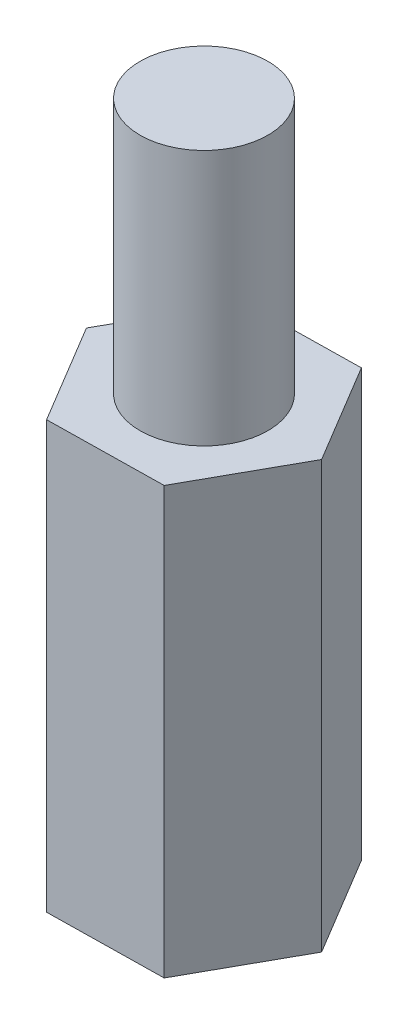
ISO-10303-21;
HEADER;
FILE_DESCRIPTION(('STEP AP214'),'2;1');
FILE_NAME('part.step','',(''),(''),'','','');
FILE_SCHEMA(('AUTOMOTIVE_DESIGN { 1 0 10303 214 1 1 1 1 }'));
ENDSEC;
DATA;
#1=APPLICATION_CONTEXT('core data for automotive mechanical design processes');
#2=APPLICATION_PROTOCOL_DEFINITION('international standard','automotive_design',2000,#1);
#3=PRODUCT_CONTEXT('',#1,'mechanical');
#4=PRODUCT('Part','Part','',(#3));
#5=PRODUCT_RELATED_PRODUCT_CATEGORY('part','',(#4));
#6=PRODUCT_DEFINITION_FORMATION('','',#4);
#7=PRODUCT_DEFINITION_CONTEXT('part definition',#1,'design');
#8=PRODUCT_DEFINITION('design','',#6,#7);
#9=PRODUCT_DEFINITION_SHAPE('','',#8);
#10=(LENGTH_UNIT() NAMED_UNIT(*) SI_UNIT(.MILLI.,.METRE.));
#11=(NAMED_UNIT(*) PLANE_ANGLE_UNIT() SI_UNIT($,.RADIAN.));
#12=(NAMED_UNIT(*) SI_UNIT($,.STERADIAN.) SOLID_ANGLE_UNIT());
#13=UNCERTAINTY_MEASURE_WITH_UNIT(LENGTH_MEASURE(1.E-05),#10,'distance_accuracy_value','');
#14=(GEOMETRIC_REPRESENTATION_CONTEXT(3) GLOBAL_UNCERTAINTY_ASSIGNED_CONTEXT((#13)) GLOBAL_UNIT_ASSIGNED_CONTEXT((#10,
#11,#12)) REPRESENTATION_CONTEXT('',''));
#15=CARTESIAN_POINT('',(0.,0.,0.));
#16=DIRECTION('',(0.,0.,1.));
#17=DIRECTION('',(1.,0.,0.));
#18=AXIS2_PLACEMENT_3D('',#15,#16,#17);
#19=CARTESIAN_POINT('',(0.,16.,0.));
#20=DIRECTION('',(0.,-1.,0.));
#21=DIRECTION('',(0.,0.,-1.));
#22=AXIS2_PLACEMENT_3D('',#19,#20,#21);
#23=CYLINDRICAL_SURFACE('',#22,1.5);
#24=CARTESIAN_POINT('',(0.,16.,0.));
#25=DIRECTION('',(0.,1.,0.));
#26=DIRECTION('',(0.,0.,1.));
#27=AXIS2_PLACEMENT_3D('',#24,#25,#26);
#28=CIRCLE('',#27,1.5);
#29=CARTESIAN_POINT('',(0.,16.,1.5));
#30=VERTEX_POINT('',#29);
#31=EDGE_CURVE('E11',#30,#30,#28,.T.);
#32=ORIENTED_EDGE('',*,*,#31,.F.);
#33=EDGE_LOOP('',(#32));
#34=FACE_BOUND('',#33,.T.);
#35=CARTESIAN_POINT('',(0.,10.,0.));
#36=DIRECTION('',(0.,1.,0.));
#37=DIRECTION('',(0.,0.,1.));
#38=AXIS2_PLACEMENT_3D('',#35,#36,#37);
#39=CIRCLE('',#38,1.5);
#40=CARTESIAN_POINT('',(0.,10.,1.5));
#41=VERTEX_POINT('',#40);
#42=EDGE_CURVE('E45',#41,#41,#39,.T.);
#43=ORIENTED_EDGE('',*,*,#42,.T.);
#44=EDGE_LOOP('',(#43));
#45=FACE_BOUND('',#44,.T.);
#46=ADVANCED_FACE('F42',(#34,#45),#23,.T.);
#47=CARTESIAN_POINT('',(0.,16.,0.));
#48=DIRECTION('',(0.,1.,0.));
#49=DIRECTION('',(0.,0.,1.));
#50=AXIS2_PLACEMENT_3D('',#47,#48,#49);
#51=PLANE('',#50);
#52=ORIENTED_EDGE('',*,*,#31,.T.);
#53=EDGE_LOOP('',(#52));
#54=FACE_BOUND('',#53,.T.);
#55=ADVANCED_FACE('F57',(#54),#51,.T.);
#56=CARTESIAN_POINT('',(0.,10.,0.));
#57=DIRECTION('',(0.,1.,0.));
#58=DIRECTION('',(0.,0.,1.));
#59=AXIS2_PLACEMENT_3D('',#56,#57,#58);
#60=PLANE('',#59);
#61=ORIENTED_EDGE('',*,*,#42,.F.);
#62=EDGE_LOOP('',(#61));
#63=FACE_BOUND('',#62,.T.);
#64=ADVANCED_FACE('F55',(#63),#60,.F.);
#65=CLOSED_SHELL('',(#46,#55,#64));
#66=MANIFOLD_SOLID_BREP('B2',#65);
#67=CARTESIAN_POINT('',(0.,10.,0.));
#68=DIRECTION('',(0.,1.,0.));
#69=DIRECTION('',(0.,0.,1.));
#70=AXIS2_PLACEMENT_3D('',#67,#68,#69);
#71=PLANE('',#70);
#72=DIRECTION('',(0.9998697085006,0.,-0.0161420575803037));
#73=VECTOR('',#72,1.);
#74=CARTESIAN_POINT('',(-1.31866252127611,10.,2.37159492500618));
#75=LINE('',#74,#73);
#76=CARTESIAN_POINT('',(-1.31866252127611,10.,2.37159492500618));
#77=VERTEX_POINT('',#76);
#78=CARTESIAN_POINT('',(1.39453019190354,10.,2.32779270494664));
#79=VERTEX_POINT('',#78);
#80=EDGE_CURVE('E178',#77,#79,#75,.T.);
#81=ORIENTED_EDGE('',*,*,#80,.T.);
#82=DIRECTION('',(0.485955422316405,0.,-0.873983596826213));
#83=VECTOR('',#82,1.);
#84=CARTESIAN_POINT('',(1.39453019190354,10.,2.32779270494664));
#85=LINE('',#84,#83);
#86=CARTESIAN_POINT('',(2.71319271317966,10.,-0.0438022200595355));
#87=VERTEX_POINT('',#86);
#88=EDGE_CURVE('E136',#79,#87,#85,.T.);
#89=ORIENTED_EDGE('',*,*,#88,.T.);
#90=DIRECTION('',(-0.513914286184194,0.,-0.857841539245909));
#91=VECTOR('',#90,1.);
#92=CARTESIAN_POINT('',(2.71319271317966,10.,-0.0438022200595355));
#93=LINE('',#92,#91);
#94=CARTESIAN_POINT('',(1.31866252127611,10.,-2.37159492500618));
#95=VERTEX_POINT('',#94);
#96=EDGE_CURVE('E149',#87,#95,#93,.T.);
#97=ORIENTED_EDGE('',*,*,#96,.T.);
#98=DIRECTION('',(-0.9998697085006,0.,0.0161420575803037));
#99=VECTOR('',#98,1.);
#100=CARTESIAN_POINT('',(1.31866252127611,10.,-2.37159492500618));
#101=LINE('',#100,#99);
#102=CARTESIAN_POINT('',(-1.39453019190354,10.,-2.32779270494664));
#103=VERTEX_POINT('',#102);
#104=EDGE_CURVE('E143',#95,#103,#101,.T.);
#105=ORIENTED_EDGE('',*,*,#104,.T.);
#106=DIRECTION('',(-0.485955422316406,0.,0.873983596826213));
#107=VECTOR('',#106,1.);
#108=CARTESIAN_POINT('',(-1.39453019190354,10.,-2.32779270494664));
#109=LINE('',#108,#107);
#110=CARTESIAN_POINT('',(-2.71319271317966,10.,0.043802220059535));
#111=VERTEX_POINT('',#110);
#112=EDGE_CURVE('E147',#103,#111,#109,.T.);
#113=ORIENTED_EDGE('',*,*,#112,.T.);
#114=DIRECTION('',(0.513914286184194,0.,0.857841539245909));
#115=VECTOR('',#114,1.);
#116=CARTESIAN_POINT('',(-2.71319271317966,10.,0.043802220059535));
#117=LINE('',#116,#115);
#118=EDGE_CURVE('E99',#111,#77,#117,.T.);
#119=ORIENTED_EDGE('',*,*,#118,.T.);
#120=EDGE_LOOP('',(#81,#89,#97,#105,#113,#119));
#121=FACE_BOUND('',#120,.T.);
#122=CARTESIAN_POINT('',(0.,10.,0.));
#123=DIRECTION('',(0.,1.,0.));
#124=DIRECTION('',(0.,0.,1.));
#125=AXIS2_PLACEMENT_3D('',#122,#123,#124);
#126=CIRCLE('',#125,1.5);
#127=CARTESIAN_POINT('',(0.,10.,1.5));
#128=VERTEX_POINT('',#127);
#129=EDGE_CURVE('E171',#128,#128,#126,.T.);
#130=ORIENTED_EDGE('',*,*,#129,.F.);
#131=EDGE_LOOP('',(#130));
#132=FACE_BOUND('',#131,.T.);
#133=ADVANCED_FACE('F82',(#121,#132),#71,.T.);
#134=CARTESIAN_POINT('',(0.,0.,0.));
#135=DIRECTION('',(0.,1.,0.));
#136=DIRECTION('',(0.,0.,1.));
#137=AXIS2_PLACEMENT_3D('',#134,#135,#136);
#138=PLANE('',#137);
#139=DIRECTION('',(0.9998697085006,0.,-0.0161420575803037));
#140=VECTOR('',#139,1.);
#141=CARTESIAN_POINT('',(-1.31866252127611,0.,2.37159492500618));
#142=LINE('',#141,#140);
#143=CARTESIAN_POINT('',(-1.31866252127611,0.,2.37159492500618));
#144=VERTEX_POINT('',#143);
#145=CARTESIAN_POINT('',(1.39453019190354,0.,2.32779270494664));
#146=VERTEX_POINT('',#145);
#147=EDGE_CURVE('E167',#144,#146,#142,.T.);
#148=ORIENTED_EDGE('',*,*,#147,.F.);
#149=DIRECTION('',(0.513914286184194,0.,0.857841539245909));
#150=VECTOR('',#149,1.);
#151=CARTESIAN_POINT('',(-2.71319271317966,0.,0.043802220059535));
#152=LINE('',#151,#150);
#153=CARTESIAN_POINT('',(-2.71319271317966,0.,0.043802220059535));
#154=VERTEX_POINT('',#153);
#155=EDGE_CURVE('E128',#154,#144,#152,.T.);
#156=ORIENTED_EDGE('',*,*,#155,.F.);
#157=DIRECTION('',(-0.485955422316406,0.,0.873983596826213));
#158=VECTOR('',#157,1.);
#159=CARTESIAN_POINT('',(-1.39453019190354,0.,-2.32779270494664));
#160=LINE('',#159,#158);
#161=CARTESIAN_POINT('',(-1.39453019190354,0.,-2.32779270494664));
#162=VERTEX_POINT('',#161);
#163=EDGE_CURVE('E122',#162,#154,#160,.T.);
#164=ORIENTED_EDGE('',*,*,#163,.F.);
#165=DIRECTION('',(-0.9998697085006,0.,0.0161420575803037));
#166=VECTOR('',#165,1.);
#167=CARTESIAN_POINT('',(1.31866252127611,0.,-2.37159492500618));
#168=LINE('',#167,#166);
#169=CARTESIAN_POINT('',(1.31866252127611,0.,-2.37159492500618));
#170=VERTEX_POINT('',#169);
#171=EDGE_CURVE('E157',#170,#162,#168,.T.);
#172=ORIENTED_EDGE('',*,*,#171,.F.);
#173=DIRECTION('',(-0.513914286184194,0.,-0.857841539245909));
#174=VECTOR('',#173,1.);
#175=CARTESIAN_POINT('',(2.71319271317966,0.,-0.0438022200595355));
#176=LINE('',#175,#174);
#177=CARTESIAN_POINT('',(2.71319271317966,0.,-0.0438022200595355));
#178=VERTEX_POINT('',#177);
#179=EDGE_CURVE('E173',#178,#170,#176,.T.);
#180=ORIENTED_EDGE('',*,*,#179,.F.);
#181=DIRECTION('',(0.485955422316405,0.,-0.873983596826213));
#182=VECTOR('',#181,1.);
#183=CARTESIAN_POINT('',(1.39453019190354,0.,2.32779270494664));
#184=LINE('',#183,#182);
#185=EDGE_CURVE('E170',#146,#178,#184,.T.);
#186=ORIENTED_EDGE('',*,*,#185,.F.);
#187=EDGE_LOOP('',(#148,#156,#164,#172,#180,#186));
#188=FACE_BOUND('',#187,.T.);
#189=CARTESIAN_POINT('',(0.,0.,0.));
#190=DIRECTION('',(0.,1.,0.));
#191=DIRECTION('',(0.,0.,1.));
#192=AXIS2_PLACEMENT_3D('',#189,#190,#191);
#193=CIRCLE('',#192,1.5);
#194=CARTESIAN_POINT('',(0.,0.,1.5));
#195=VERTEX_POINT('',#194);
#196=EDGE_CURVE('E271',#195,#195,#193,.T.);
#197=ORIENTED_EDGE('',*,*,#196,.T.);
#198=EDGE_LOOP('',(#197));
#199=FACE_BOUND('',#198,.T.);
#200=ADVANCED_FACE('F187',(#188,#199),#138,.F.);
#201=CARTESIAN_POINT('',(-1.31866252127611,10.,2.37159492500618));
#202=DIRECTION('',(-0.0161420575803037,0.,-0.9998697085006));
#203=DIRECTION('',(-0.9998697085006,0.,0.0161420575803037));
#204=AXIS2_PLACEMENT_3D('',#201,#202,#203);
#205=PLANE('',#204);
#206=ORIENTED_EDGE('',*,*,#147,.T.);
#207=DIRECTION('',(0.,-1.,0.));
#208=VECTOR('',#207,1.);
#209=CARTESIAN_POINT('',(1.39453019190354,10.,2.32779270494664));
#210=LINE('',#209,#208);
#211=EDGE_CURVE('E40',#79,#146,#210,.T.);
#212=ORIENTED_EDGE('',*,*,#211,.F.);
#213=ORIENTED_EDGE('',*,*,#80,.F.);
#214=DIRECTION('',(0.,-1.,0.));
#215=VECTOR('',#214,1.);
#216=CARTESIAN_POINT('',(-1.31866252127611,10.,2.37159492500618));
#217=LINE('',#216,#215);
#218=EDGE_CURVE('E163',#77,#144,#217,.T.);
#219=ORIENTED_EDGE('',*,*,#218,.T.);
#220=EDGE_LOOP('',(#206,#212,#213,#219));
#221=FACE_BOUND('',#220,.T.);
#222=ADVANCED_FACE('F84',(#221),#205,.F.);
#223=CARTESIAN_POINT('',(1.39453019190354,10.,2.32779270494664));
#224=DIRECTION('',(-0.873983596826213,0.,-0.485955422316406));
#225=DIRECTION('',(-0.485955422316406,0.,0.873983596826213));
#226=AXIS2_PLACEMENT_3D('',#223,#224,#225);
#227=PLANE('',#226);
#228=ORIENTED_EDGE('',*,*,#185,.T.);
#229=DIRECTION('',(0.,-1.,0.));
#230=VECTOR('',#229,1.);
#231=CARTESIAN_POINT('',(2.71319271317966,10.,-0.0438022200595355));
#232=LINE('',#231,#230);
#233=EDGE_CURVE('E91',#87,#178,#232,.T.);
#234=ORIENTED_EDGE('',*,*,#233,.F.);
#235=ORIENTED_EDGE('',*,*,#88,.F.);
#236=ORIENTED_EDGE('',*,*,#211,.T.);
#237=EDGE_LOOP('',(#228,#234,#235,#236));
#238=FACE_BOUND('',#237,.T.);
#239=ADVANCED_FACE('F212',(#238),#227,.F.);
#240=CARTESIAN_POINT('',(2.71319271317966,10.,-0.0438022200595355));
#241=DIRECTION('',(-0.857841539245909,0.,0.513914286184194));
#242=DIRECTION('',(0.513914286184194,0.,0.857841539245909));
#243=AXIS2_PLACEMENT_3D('',#240,#241,#242);
#244=PLANE('',#243);
#245=ORIENTED_EDGE('',*,*,#179,.T.);
#246=DIRECTION('',(0.,-1.,0.));
#247=VECTOR('',#246,1.);
#248=CARTESIAN_POINT('',(1.31866252127611,10.,-2.37159492500618));
#249=LINE('',#248,#247);
#250=EDGE_CURVE('E158',#95,#170,#249,.T.);
#251=ORIENTED_EDGE('',*,*,#250,.F.);
#252=ORIENTED_EDGE('',*,*,#96,.F.);
#253=ORIENTED_EDGE('',*,*,#233,.T.);
#254=EDGE_LOOP('',(#245,#251,#252,#253));
#255=FACE_BOUND('',#254,.T.);
#256=ADVANCED_FACE('F184',(#255),#244,.F.);
#257=CARTESIAN_POINT('',(1.31866252127611,10.,-2.37159492500618));
#258=DIRECTION('',(0.0161420575803037,0.,0.9998697085006));
#259=DIRECTION('',(0.9998697085006,0.,-0.0161420575803038));
#260=AXIS2_PLACEMENT_3D('',#257,#258,#259);
#261=PLANE('',#260);
#262=ORIENTED_EDGE('',*,*,#171,.T.);
#263=DIRECTION('',(0.,-1.,0.));
#264=VECTOR('',#263,1.);
#265=CARTESIAN_POINT('',(-1.39453019190354,10.,-2.32779270494664));
#266=LINE('',#265,#264);
#267=EDGE_CURVE('E154',#103,#162,#266,.T.);
#268=ORIENTED_EDGE('',*,*,#267,.F.);
#269=ORIENTED_EDGE('',*,*,#104,.F.);
#270=ORIENTED_EDGE('',*,*,#250,.T.);
#271=EDGE_LOOP('',(#262,#268,#269,#270));
#272=FACE_BOUND('',#271,.T.);
#273=ADVANCED_FACE('F155',(#272),#261,.F.);
#274=CARTESIAN_POINT('',(-1.39453019190354,10.,-2.32779270494664));
#275=DIRECTION('',(0.873983596826213,0.,0.485955422316406));
#276=DIRECTION('',(0.485955422316406,0.,-0.873983596826213));
#277=AXIS2_PLACEMENT_3D('',#274,#275,#276);
#278=PLANE('',#277);
#279=ORIENTED_EDGE('',*,*,#163,.T.);
#280=DIRECTION('',(0.,-1.,0.));
#281=VECTOR('',#280,1.);
#282=CARTESIAN_POINT('',(-2.71319271317966,10.,0.043802220059535));
#283=LINE('',#282,#281);
#284=EDGE_CURVE('E159',#111,#154,#283,.T.);
#285=ORIENTED_EDGE('',*,*,#284,.F.);
#286=ORIENTED_EDGE('',*,*,#112,.F.);
#287=ORIENTED_EDGE('',*,*,#267,.T.);
#288=EDGE_LOOP('',(#279,#285,#286,#287));
#289=FACE_BOUND('',#288,.T.);
#290=ADVANCED_FACE('F161',(#289),#278,.F.);
#291=CARTESIAN_POINT('',(-2.71319271317966,10.,0.043802220059535));
#292=DIRECTION('',(0.857841539245909,0.,-0.513914286184194));
#293=DIRECTION('',(-0.513914286184194,0.,-0.857841539245909));
#294=AXIS2_PLACEMENT_3D('',#291,#292,#293);
#295=PLANE('',#294);
#296=ORIENTED_EDGE('',*,*,#155,.T.);
#297=ORIENTED_EDGE('',*,*,#218,.F.);
#298=ORIENTED_EDGE('',*,*,#118,.F.);
#299=ORIENTED_EDGE('',*,*,#284,.T.);
#300=EDGE_LOOP('',(#296,#297,#298,#299));
#301=FACE_BOUND('',#300,.T.);
#302=ADVANCED_FACE('F192',(#301),#295,.F.);
#303=CARTESIAN_POINT('',(0.,10.,0.));
#304=DIRECTION('',(0.,-1.,0.));
#305=DIRECTION('',(0.,0.,-1.));
#306=AXIS2_PLACEMENT_3D('',#303,#304,#305);
#307=CYLINDRICAL_SURFACE('',#306,1.5);
#308=ORIENTED_EDGE('',*,*,#129,.T.);
#309=EDGE_LOOP('',(#308));
#310=FACE_BOUND('',#309,.T.);
#311=ORIENTED_EDGE('',*,*,#196,.F.);
#312=EDGE_LOOP('',(#311));
#313=FACE_BOUND('',#312,.T.);
#314=ADVANCED_FACE('F194',(#310,#313),#307,.F.);
#315=CLOSED_SHELL('',(#133,#200,#222,#239,#256,#273,#290,#302,#314));
#316=MANIFOLD_SOLID_BREP('B6',#315);
#317=ADVANCED_BREP_SHAPE_REPRESENTATION('',(#18,#66,#316),#14);
#318=SHAPE_DEFINITION_REPRESENTATION(#9,#317);
ENDSEC;
END-ISO-10303-21;
